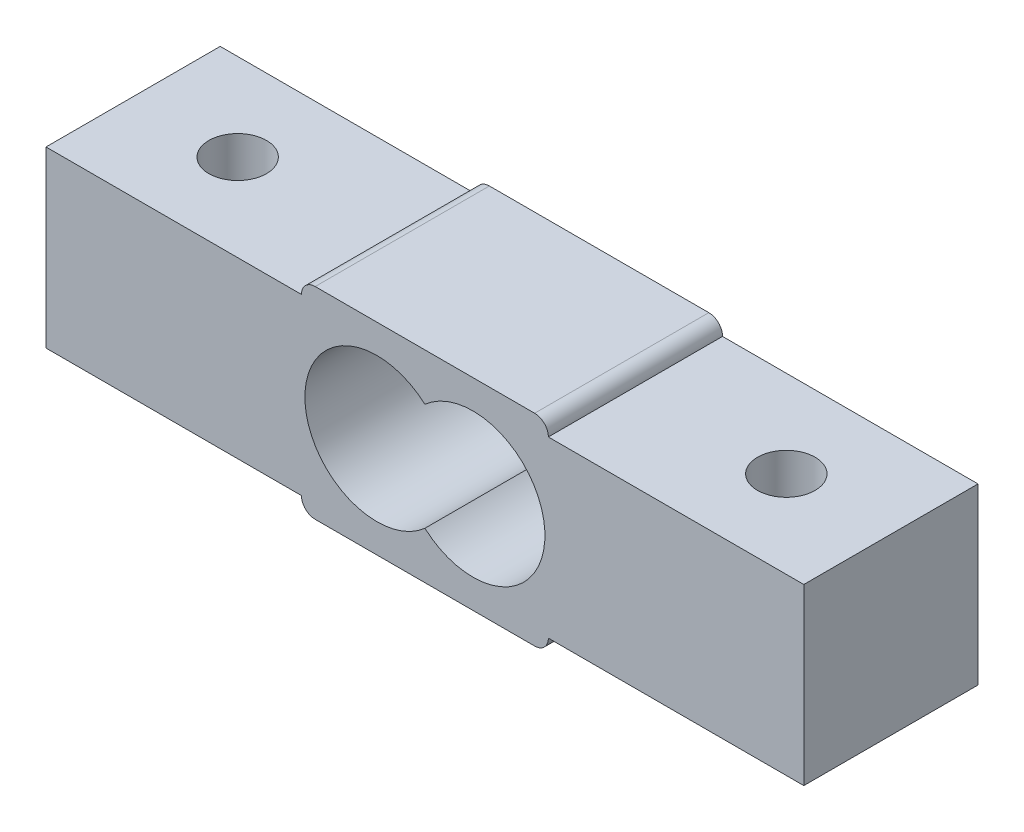
ISO-10303-21;
HEADER;
FILE_DESCRIPTION(('STEP AP214'),'2;1');
FILE_NAME('part.step','',(''),(''),'','','');
FILE_SCHEMA(('AUTOMOTIVE_DESIGN { 1 0 10303 214 1 1 1 1 }'));
ENDSEC;
DATA;
#1=APPLICATION_CONTEXT('core data for automotive mechanical design processes');
#2=APPLICATION_PROTOCOL_DEFINITION('international standard','automotive_design',2000,#1);
#3=PRODUCT_CONTEXT('',#1,'mechanical');
#4=PRODUCT('Part','Part','',(#3));
#5=PRODUCT_RELATED_PRODUCT_CATEGORY('part','',(#4));
#6=PRODUCT_DEFINITION_FORMATION('','',#4);
#7=PRODUCT_DEFINITION_CONTEXT('part definition',#1,'design');
#8=PRODUCT_DEFINITION('design','',#6,#7);
#9=PRODUCT_DEFINITION_SHAPE('','',#8);
#10=(LENGTH_UNIT() NAMED_UNIT(*) SI_UNIT(.MILLI.,.METRE.));
#11=(NAMED_UNIT(*) PLANE_ANGLE_UNIT() SI_UNIT($,.RADIAN.));
#12=(NAMED_UNIT(*) SI_UNIT($,.STERADIAN.) SOLID_ANGLE_UNIT());
#13=UNCERTAINTY_MEASURE_WITH_UNIT(LENGTH_MEASURE(1.E-05),#10,'distance_accuracy_value','');
#14=(GEOMETRIC_REPRESENTATION_CONTEXT(3) GLOBAL_UNCERTAINTY_ASSIGNED_CONTEXT((#13)) GLOBAL_UNIT_ASSIGNED_CONTEXT((#10,
#11,#12)) REPRESENTATION_CONTEXT('',''));
#15=CARTESIAN_POINT('',(0.,0.,0.));
#16=DIRECTION('',(0.,0.,1.));
#17=DIRECTION('',(1.,0.,0.));
#18=AXIS2_PLACEMENT_3D('',#15,#16,#17);
#19=CARTESIAN_POINT('',(-27.625,-6.35,12.7));
#20=DIRECTION('',(0.,1.,0.));
#21=DIRECTION('',(0.,0.,1.));
#22=AXIS2_PLACEMENT_3D('',#19,#20,#21);
#23=PLANE('',#22);
#24=CARTESIAN_POINT('',(20.,-6.35,6.35000000000001));
#25=DIRECTION('',(0.,1.,0.));
#26=DIRECTION('',(0.,0.,1.));
#27=AXIS2_PLACEMENT_3D('',#24,#25,#26);
#28=CIRCLE('',#27,2.1);
#29=CARTESIAN_POINT('',(20.,-6.35,8.45));
#30=VERTEX_POINT('',#29);
#31=EDGE_CURVE('E229',#30,#30,#28,.T.);
#32=ORIENTED_EDGE('',*,*,#31,.T.);
#33=EDGE_LOOP('',(#32));
#34=FACE_BOUND('',#33,.T.);
#35=DIRECTION('',(1.,0.,0.));
#36=VECTOR('',#35,1.);
#37=CARTESIAN_POINT('',(-27.625,-6.35,12.7));
#38=LINE('',#37,#36);
#39=CARTESIAN_POINT('',(9.,-6.35,12.7));
#40=VERTEX_POINT('',#39);
#41=CARTESIAN_POINT('',(27.625,-6.35,12.7));
#42=VERTEX_POINT('',#41);
#43=EDGE_CURVE('E142',#40,#42,#38,.T.);
#44=ORIENTED_EDGE('',*,*,#43,.F.);
#45=DIRECTION('',(0.,0.,-1.));
#46=VECTOR('',#45,1.);
#47=CARTESIAN_POINT('',(9.,-6.35,12.7));
#48=LINE('',#47,#46);
#49=CARTESIAN_POINT('',(9.,-6.35,0.));
#50=VERTEX_POINT('',#49);
#51=EDGE_CURVE('E153',#40,#50,#48,.T.);
#52=ORIENTED_EDGE('',*,*,#51,.T.);
#53=DIRECTION('',(1.,0.,0.));
#54=VECTOR('',#53,1.);
#55=CARTESIAN_POINT('',(-27.625,-6.35,0.));
#56=LINE('',#55,#54);
#57=CARTESIAN_POINT('',(27.625,-6.35,0.));
#58=VERTEX_POINT('',#57);
#59=EDGE_CURVE('E200',#50,#58,#56,.T.);
#60=ORIENTED_EDGE('',*,*,#59,.T.);
#61=DIRECTION('',(0.,0.,-1.));
#62=VECTOR('',#61,1.);
#63=CARTESIAN_POINT('',(27.625,-6.35,12.7));
#64=LINE('',#63,#62);
#65=EDGE_CURVE('E156',#42,#58,#64,.T.);
#66=ORIENTED_EDGE('',*,*,#65,.F.);
#67=EDGE_LOOP('',(#44,#52,#60,#66));
#68=FACE_BOUND('',#67,.T.);
#69=ADVANCED_FACE('F36',(#34,#68),#23,.F.);
#70=CARTESIAN_POINT('',(-27.625,6.35,12.7));
#71=DIRECTION('',(0.,-1.,0.));
#72=DIRECTION('',(0.,0.,-1.));
#73=AXIS2_PLACEMENT_3D('',#70,#71,#72);
#74=PLANE('',#73);
#75=CARTESIAN_POINT('',(20.,6.35,6.35000000000001));
#76=DIRECTION('',(0.,1.,0.));
#77=DIRECTION('',(0.,0.,1.));
#78=AXIS2_PLACEMENT_3D('',#75,#76,#77);
#79=CIRCLE('',#78,2.1);
#80=CARTESIAN_POINT('',(20.,6.35,8.45));
#81=VERTEX_POINT('',#80);
#82=EDGE_CURVE('E328',#81,#81,#79,.T.);
#83=ORIENTED_EDGE('',*,*,#82,.F.);
#84=EDGE_LOOP('',(#83));
#85=FACE_BOUND('',#84,.T.);
#86=DIRECTION('',(0.,0.,-1.));
#87=VECTOR('',#86,1.);
#88=CARTESIAN_POINT('',(9.,6.35,12.7));
#89=LINE('',#88,#87);
#90=CARTESIAN_POINT('',(8.99999999999999,6.35,12.7));
#91=VERTEX_POINT('',#90);
#92=CARTESIAN_POINT('',(8.99999999999999,6.35,0.));
#93=VERTEX_POINT('',#92);
#94=EDGE_CURVE('E190',#91,#93,#89,.T.);
#95=ORIENTED_EDGE('',*,*,#94,.F.);
#96=DIRECTION('',(-1.,0.,0.));
#97=VECTOR('',#96,1.);
#98=CARTESIAN_POINT('',(-27.625,6.35,12.7));
#99=LINE('',#98,#97);
#100=CARTESIAN_POINT('',(27.625,6.35,12.7));
#101=VERTEX_POINT('',#100);
#102=EDGE_CURVE('E341',#101,#91,#99,.T.);
#103=ORIENTED_EDGE('',*,*,#102,.F.);
#104=DIRECTION('',(0.,0.,-1.));
#105=VECTOR('',#104,1.);
#106=CARTESIAN_POINT('',(27.625,6.35,12.7));
#107=LINE('',#106,#105);
#108=CARTESIAN_POINT('',(27.625,6.35,0.));
#109=VERTEX_POINT('',#108);
#110=EDGE_CURVE('E215',#101,#109,#107,.T.);
#111=ORIENTED_EDGE('',*,*,#110,.T.);
#112=DIRECTION('',(-1.,0.,0.));
#113=VECTOR('',#112,1.);
#114=CARTESIAN_POINT('',(-27.625,6.35,0.));
#115=LINE('',#114,#113);
#116=EDGE_CURVE('E218',#109,#93,#115,.T.);
#117=ORIENTED_EDGE('',*,*,#116,.T.);
#118=EDGE_LOOP('',(#95,#103,#111,#117));
#119=FACE_BOUND('',#118,.T.);
#120=ADVANCED_FACE('F304',(#85,#119),#74,.F.);
#121=CARTESIAN_POINT('',(-20.,6.35,6.35000000000001));
#122=DIRECTION('',(0.,1.,0.));
#123=DIRECTION('',(0.,0.,1.));
#124=AXIS2_PLACEMENT_3D('',#121,#122,#123);
#125=CIRCLE('',#124,2.1);
#126=CARTESIAN_POINT('',(-20.,6.35,8.45));
#127=VERTEX_POINT('',#126);
#128=EDGE_CURVE('E329',#127,#127,#125,.T.);
#129=ORIENTED_EDGE('',*,*,#128,.F.);
#130=EDGE_LOOP('',(#129));
#131=FACE_BOUND('',#130,.T.);
#132=DIRECTION('',(0.,0.,1.));
#133=VECTOR('',#132,1.);
#134=CARTESIAN_POINT('',(-9.,6.35,12.7));
#135=LINE('',#134,#133);
#136=CARTESIAN_POINT('',(-9.,6.35,0.));
#137=VERTEX_POINT('',#136);
#138=CARTESIAN_POINT('',(-9.,6.35,12.7));
#139=VERTEX_POINT('',#138);
#140=EDGE_CURVE('E182',#137,#139,#135,.T.);
#141=ORIENTED_EDGE('',*,*,#140,.F.);
#142=CARTESIAN_POINT('',(-27.625,6.35,0.));
#143=VERTEX_POINT('',#142);
#144=EDGE_CURVE('E221',#137,#143,#115,.T.);
#145=ORIENTED_EDGE('',*,*,#144,.T.);
#146=DIRECTION('',(0.,0.,-1.));
#147=VECTOR('',#146,1.);
#148=CARTESIAN_POINT('',(-27.625,6.35,12.7));
#149=LINE('',#148,#147);
#150=CARTESIAN_POINT('',(-27.625,6.35,12.7));
#151=VERTEX_POINT('',#150);
#152=EDGE_CURVE('E212',#151,#143,#149,.T.);
#153=ORIENTED_EDGE('',*,*,#152,.F.);
#154=EDGE_CURVE('E295',#139,#151,#99,.T.);
#155=ORIENTED_EDGE('',*,*,#154,.F.);
#156=EDGE_LOOP('',(#141,#145,#153,#155));
#157=FACE_BOUND('',#156,.T.);
#158=ADVANCED_FACE('F294',(#131,#157),#74,.F.);
#159=CARTESIAN_POINT('',(27.625,-6.35,12.7));
#160=DIRECTION('',(-1.,0.,0.));
#161=DIRECTION('',(0.,0.,1.));
#162=AXIS2_PLACEMENT_3D('',#159,#160,#161);
#163=PLANE('',#162);
#164=DIRECTION('',(0.,1.,0.));
#165=VECTOR('',#164,1.);
#166=CARTESIAN_POINT('',(27.625,-6.35,0.));
#167=LINE('',#166,#165);
#168=EDGE_CURVE('E225',#58,#109,#167,.T.);
#169=ORIENTED_EDGE('',*,*,#168,.T.);
#170=ORIENTED_EDGE('',*,*,#110,.F.);
#171=DIRECTION('',(0.,1.,0.));
#172=VECTOR('',#171,1.);
#173=CARTESIAN_POINT('',(27.625,-6.35,12.7));
#174=LINE('',#173,#172);
#175=EDGE_CURVE('E199',#42,#101,#174,.T.);
#176=ORIENTED_EDGE('',*,*,#175,.F.);
#177=ORIENTED_EDGE('',*,*,#65,.T.);
#178=EDGE_LOOP('',(#169,#170,#176,#177));
#179=FACE_BOUND('',#178,.T.);
#180=ADVANCED_FACE('F323',(#179),#163,.F.);
#181=CARTESIAN_POINT('',(-27.625,-6.35,12.7));
#182=DIRECTION('',(1.,0.,0.));
#183=DIRECTION('',(0.,0.,-1.));
#184=AXIS2_PLACEMENT_3D('',#181,#182,#183);
#185=PLANE('',#184);
#186=DIRECTION('',(0.,-1.,0.));
#187=VECTOR('',#186,1.);
#188=CARTESIAN_POINT('',(-27.625,-6.35,0.));
#189=LINE('',#188,#187);
#190=CARTESIAN_POINT('',(-27.625,-6.35,0.));
#191=VERTEX_POINT('',#190);
#192=EDGE_CURVE('E205',#143,#191,#189,.T.);
#193=ORIENTED_EDGE('',*,*,#192,.T.);
#194=DIRECTION('',(0.,0.,-1.));
#195=VECTOR('',#194,1.);
#196=CARTESIAN_POINT('',(-27.625,-6.35,12.7));
#197=LINE('',#196,#195);
#198=CARTESIAN_POINT('',(-27.625,-6.35,12.7));
#199=VERTEX_POINT('',#198);
#200=EDGE_CURVE('E209',#199,#191,#197,.T.);
#201=ORIENTED_EDGE('',*,*,#200,.F.);
#202=DIRECTION('',(0.,-1.,0.));
#203=VECTOR('',#202,1.);
#204=CARTESIAN_POINT('',(-27.625,-6.35,12.7));
#205=LINE('',#204,#203);
#206=EDGE_CURVE('E159',#151,#199,#205,.T.);
#207=ORIENTED_EDGE('',*,*,#206,.F.);
#208=ORIENTED_EDGE('',*,*,#152,.T.);
#209=EDGE_LOOP('',(#193,#201,#207,#208));
#210=FACE_BOUND('',#209,.T.);
#211=ADVANCED_FACE('F290',(#210),#185,.F.);
#212=CARTESIAN_POINT('',(-20.,-6.35,6.35000000000001));
#213=DIRECTION('',(0.,1.,0.));
#214=DIRECTION('',(0.,0.,1.));
#215=AXIS2_PLACEMENT_3D('',#212,#213,#214);
#216=CIRCLE('',#215,2.1);
#217=CARTESIAN_POINT('',(-20.,-6.35,8.45));
#218=VERTEX_POINT('',#217);
#219=EDGE_CURVE('E326',#218,#218,#216,.T.);
#220=ORIENTED_EDGE('',*,*,#219,.T.);
#221=EDGE_LOOP('',(#220));
#222=FACE_BOUND('',#221,.T.);
#223=CARTESIAN_POINT('',(-9.,-6.35,0.));
#224=VERTEX_POINT('',#223);
#225=EDGE_CURVE('E195',#191,#224,#56,.T.);
#226=ORIENTED_EDGE('',*,*,#225,.T.);
#227=DIRECTION('',(0.,0.,1.));
#228=VECTOR('',#227,1.);
#229=CARTESIAN_POINT('',(-9.,-6.35,12.7));
#230=LINE('',#229,#228);
#231=CARTESIAN_POINT('',(-9.,-6.35,12.7));
#232=VERTEX_POINT('',#231);
#233=EDGE_CURVE('E163',#224,#232,#230,.T.);
#234=ORIENTED_EDGE('',*,*,#233,.T.);
#235=EDGE_CURVE('E158',#199,#232,#38,.T.);
#236=ORIENTED_EDGE('',*,*,#235,.F.);
#237=ORIENTED_EDGE('',*,*,#200,.T.);
#238=EDGE_LOOP('',(#226,#234,#236,#237));
#239=FACE_BOUND('',#238,.T.);
#240=ADVANCED_FACE('F239',(#222,#239),#23,.F.);
#241=CARTESIAN_POINT('',(0.,0.,12.7));
#242=DIRECTION('',(0.,0.,-1.));
#243=DIRECTION('',(-1.,0.,0.));
#244=AXIS2_PLACEMENT_3D('',#241,#242,#243);
#245=PLANE('',#244);
#246=CARTESIAN_POINT('',(-3.5,0.,12.7));
#247=DIRECTION('',(0.,0.,1.));
#248=DIRECTION('',(1.,0.,0.));
#249=AXIS2_PLACEMENT_3D('',#246,#247,#248);
#250=CIRCLE('',#249,5.25);
#251=CARTESIAN_POINT('',(0.,3.91311896062463,12.7));
#252=VERTEX_POINT('',#251);
#253=CARTESIAN_POINT('',(0.,-3.91311896062463,12.7));
#254=VERTEX_POINT('',#253);
#255=EDGE_CURVE('E386',#252,#254,#250,.T.);
#256=ORIENTED_EDGE('',*,*,#255,.F.);
#257=CARTESIAN_POINT('',(3.5,0.,12.7));
#258=DIRECTION('',(0.,0.,1.));
#259=DIRECTION('',(1.,0.,0.));
#260=AXIS2_PLACEMENT_3D('',#257,#258,#259);
#261=CIRCLE('',#260,5.25);
#262=EDGE_CURVE('E184',#254,#252,#261,.T.);
#263=ORIENTED_EDGE('',*,*,#262,.F.);
#264=EDGE_LOOP('',(#256,#263));
#265=FACE_BOUND('',#264,.T.);
#266=DIRECTION('',(1.,0.,0.));
#267=VECTOR('',#266,1.);
#268=CARTESIAN_POINT('',(-9.,-7.35,12.7));
#269=LINE('',#268,#267);
#270=CARTESIAN_POINT('',(-8.,-7.35,12.7));
#271=VERTEX_POINT('',#270);
#272=CARTESIAN_POINT('',(8.,-7.35,12.7));
#273=VERTEX_POINT('',#272);
#274=EDGE_CURVE('E145',#271,#273,#269,.T.);
#275=ORIENTED_EDGE('',*,*,#274,.T.);
#276=CARTESIAN_POINT('',(8.,-6.35,12.7));
#277=DIRECTION('',(0.,0.,-1.));
#278=DIRECTION('',(-1.,0.,0.));
#279=AXIS2_PLACEMENT_3D('',#276,#277,#278);
#280=CIRCLE('',#279,1.);
#281=EDGE_CURVE('E138',#273,#40,#280,.F.);
#282=ORIENTED_EDGE('',*,*,#281,.T.);
#283=ORIENTED_EDGE('',*,*,#43,.T.);
#284=ORIENTED_EDGE('',*,*,#175,.T.);
#285=ORIENTED_EDGE('',*,*,#102,.T.);
#286=CARTESIAN_POINT('',(8.,6.35,12.7));
#287=DIRECTION('',(0.,0.,-1.));
#288=DIRECTION('',(-1.,0.,0.));
#289=AXIS2_PLACEMENT_3D('',#286,#287,#288);
#290=CIRCLE('',#289,1.);
#291=CARTESIAN_POINT('',(8.,7.35,12.7));
#292=VERTEX_POINT('',#291);
#293=EDGE_CURVE('E51',#91,#292,#290,.F.);
#294=ORIENTED_EDGE('',*,*,#293,.T.);
#295=DIRECTION('',(1.,0.,0.));
#296=VECTOR('',#295,1.);
#297=CARTESIAN_POINT('',(-9.,7.35,12.7));
#298=LINE('',#297,#296);
#299=CARTESIAN_POINT('',(-8.,7.35,12.7));
#300=VERTEX_POINT('',#299);
#301=EDGE_CURVE('E181',#300,#292,#298,.T.);
#302=ORIENTED_EDGE('',*,*,#301,.F.);
#303=CARTESIAN_POINT('',(-8.,6.35,12.7));
#304=DIRECTION('',(0.,0.,-1.));
#305=DIRECTION('',(-1.,0.,0.));
#306=AXIS2_PLACEMENT_3D('',#303,#304,#305);
#307=CIRCLE('',#306,1.);
#308=EDGE_CURVE('E59',#300,#139,#307,.F.);
#309=ORIENTED_EDGE('',*,*,#308,.T.);
#310=ORIENTED_EDGE('',*,*,#154,.T.);
#311=ORIENTED_EDGE('',*,*,#206,.T.);
#312=ORIENTED_EDGE('',*,*,#235,.T.);
#313=CARTESIAN_POINT('',(-8.,-6.35,12.7));
#314=DIRECTION('',(0.,0.,-1.));
#315=DIRECTION('',(-1.,0.,0.));
#316=AXIS2_PLACEMENT_3D('',#313,#314,#315);
#317=CIRCLE('',#316,1.);
#318=EDGE_CURVE('E149',#232,#271,#317,.F.);
#319=ORIENTED_EDGE('',*,*,#318,.T.);
#320=EDGE_LOOP('',(#275,#282,#283,#284,#285,#294,#302,#309,#310,#311,#312,#319));
#321=FACE_BOUND('',#320,.T.);
#322=ADVANCED_FACE('F140',(#265,#321),#245,.F.);
#323=CARTESIAN_POINT('',(0.,0.,0.));
#324=DIRECTION('',(0.,0.,-1.));
#325=DIRECTION('',(-1.,0.,0.));
#326=AXIS2_PLACEMENT_3D('',#323,#324,#325);
#327=PLANE('',#326);
#328=CARTESIAN_POINT('',(3.5,0.,0.));
#329=DIRECTION('',(0.,0.,1.));
#330=DIRECTION('',(1.,0.,0.));
#331=AXIS2_PLACEMENT_3D('',#328,#329,#330);
#332=CIRCLE('',#331,5.25);
#333=CARTESIAN_POINT('',(0.,-3.91311896062463,0.));
#334=VERTEX_POINT('',#333);
#335=CARTESIAN_POINT('',(0.,3.91311896062463,0.));
#336=VERTEX_POINT('',#335);
#337=EDGE_CURVE('E382',#334,#336,#332,.T.);
#338=ORIENTED_EDGE('',*,*,#337,.T.);
#339=CARTESIAN_POINT('',(-3.5,0.,0.));
#340=DIRECTION('',(0.,0.,1.));
#341=DIRECTION('',(1.,0.,0.));
#342=AXIS2_PLACEMENT_3D('',#339,#340,#341);
#343=CIRCLE('',#342,5.25);
#344=EDGE_CURVE('E384',#336,#334,#343,.T.);
#345=ORIENTED_EDGE('',*,*,#344,.T.);
#346=EDGE_LOOP('',(#338,#345));
#347=FACE_BOUND('',#346,.T.);
#348=ORIENTED_EDGE('',*,*,#59,.F.);
#349=CARTESIAN_POINT('',(8.,-6.35,0.));
#350=DIRECTION('',(0.,0.,-1.));
#351=DIRECTION('',(-1.,0.,0.));
#352=AXIS2_PLACEMENT_3D('',#349,#350,#351);
#353=CIRCLE('',#352,1.);
#354=CARTESIAN_POINT('',(8.,-7.35,0.));
#355=VERTEX_POINT('',#354);
#356=EDGE_CURVE('E162',#50,#355,#353,.T.);
#357=ORIENTED_EDGE('',*,*,#356,.T.);
#358=DIRECTION('',(-1.,0.,0.));
#359=VECTOR('',#358,1.);
#360=CARTESIAN_POINT('',(-9.,-7.35,0.));
#361=LINE('',#360,#359);
#362=CARTESIAN_POINT('',(-8.,-7.35,0.));
#363=VERTEX_POINT('',#362);
#364=EDGE_CURVE('E174',#355,#363,#361,.T.);
#365=ORIENTED_EDGE('',*,*,#364,.T.);
#366=CARTESIAN_POINT('',(-8.,-6.35,0.));
#367=DIRECTION('',(0.,0.,-1.));
#368=DIRECTION('',(-1.,0.,0.));
#369=AXIS2_PLACEMENT_3D('',#366,#367,#368);
#370=CIRCLE('',#369,1.);
#371=EDGE_CURVE('E246',#363,#224,#370,.T.);
#372=ORIENTED_EDGE('',*,*,#371,.T.);
#373=ORIENTED_EDGE('',*,*,#225,.F.);
#374=ORIENTED_EDGE('',*,*,#192,.F.);
#375=ORIENTED_EDGE('',*,*,#144,.F.);
#376=CARTESIAN_POINT('',(-8.,6.35,0.));
#377=DIRECTION('',(0.,0.,-1.));
#378=DIRECTION('',(-1.,0.,0.));
#379=AXIS2_PLACEMENT_3D('',#376,#377,#378);
#380=CIRCLE('',#379,1.);
#381=CARTESIAN_POINT('',(-8.,7.35,0.));
#382=VERTEX_POINT('',#381);
#383=EDGE_CURVE('E266',#137,#382,#380,.T.);
#384=ORIENTED_EDGE('',*,*,#383,.T.);
#385=DIRECTION('',(-1.,0.,0.));
#386=VECTOR('',#385,1.);
#387=CARTESIAN_POINT('',(-9.,7.35,0.));
#388=LINE('',#387,#386);
#389=CARTESIAN_POINT('',(8.,7.35,0.));
#390=VERTEX_POINT('',#389);
#391=EDGE_CURVE('E178',#390,#382,#388,.T.);
#392=ORIENTED_EDGE('',*,*,#391,.F.);
#393=CARTESIAN_POINT('',(8.,6.35,0.));
#394=DIRECTION('',(0.,0.,-1.));
#395=DIRECTION('',(-1.,0.,0.));
#396=AXIS2_PLACEMENT_3D('',#393,#394,#395);
#397=CIRCLE('',#396,1.);
#398=EDGE_CURVE('E170',#390,#93,#397,.T.);
#399=ORIENTED_EDGE('',*,*,#398,.T.);
#400=ORIENTED_EDGE('',*,*,#116,.F.);
#401=ORIENTED_EDGE('',*,*,#168,.F.);
#402=EDGE_LOOP('',(#348,#357,#365,#372,#373,#374,#375,#384,#392,#399,#400,#401));
#403=FACE_BOUND('',#402,.T.);
#404=ADVANCED_FACE('F263',(#347,#403),#327,.T.);
#405=CARTESIAN_POINT('',(20.,6.35,6.35000000000001));
#406=DIRECTION('',(0.,1.,0.));
#407=DIRECTION('',(0.,0.,1.));
#408=AXIS2_PLACEMENT_3D('',#405,#406,#407);
#409=CYLINDRICAL_SURFACE('',#408,2.1);
#410=ORIENTED_EDGE('',*,*,#31,.F.);
#411=EDGE_LOOP('',(#410));
#412=FACE_BOUND('',#411,.T.);
#413=ORIENTED_EDGE('',*,*,#82,.T.);
#414=EDGE_LOOP('',(#413));
#415=FACE_BOUND('',#414,.T.);
#416=ADVANCED_FACE('F373',(#412,#415),#409,.F.);
#417=CARTESIAN_POINT('',(-20.,6.35,6.35000000000001));
#418=DIRECTION('',(0.,1.,0.));
#419=DIRECTION('',(0.,0.,1.));
#420=AXIS2_PLACEMENT_3D('',#417,#418,#419);
#421=CYLINDRICAL_SURFACE('',#420,2.1);
#422=ORIENTED_EDGE('',*,*,#219,.F.);
#423=EDGE_LOOP('',(#422));
#424=FACE_BOUND('',#423,.T.);
#425=ORIENTED_EDGE('',*,*,#128,.T.);
#426=EDGE_LOOP('',(#425));
#427=FACE_BOUND('',#426,.T.);
#428=ADVANCED_FACE('F369',(#424,#427),#421,.F.);
#429=CARTESIAN_POINT('',(3.5,0.,0.));
#430=DIRECTION('',(0.,0.,1.));
#431=DIRECTION('',(1.,0.,0.));
#432=AXIS2_PLACEMENT_3D('',#429,#430,#431);
#433=CYLINDRICAL_SURFACE('',#432,5.25);
#434=ORIENTED_EDGE('',*,*,#262,.T.);
#435=DIRECTION('',(0.,0.,1.));
#436=VECTOR('',#435,1.);
#437=CARTESIAN_POINT('',(0.,3.91311896062463,0.));
#438=LINE('',#437,#436);
#439=EDGE_CURVE('E387',#336,#252,#438,.T.);
#440=ORIENTED_EDGE('',*,*,#439,.F.);
#441=ORIENTED_EDGE('',*,*,#337,.F.);
#442=DIRECTION('',(0.,0.,1.));
#443=VECTOR('',#442,1.);
#444=CARTESIAN_POINT('',(0.,-3.91311896062463,0.));
#445=LINE('',#444,#443);
#446=EDGE_CURVE('E334',#334,#254,#445,.T.);
#447=ORIENTED_EDGE('',*,*,#446,.T.);
#448=EDGE_LOOP('',(#434,#440,#441,#447));
#449=FACE_BOUND('',#448,.T.);
#450=ADVANCED_FACE('F365',(#449),#433,.F.);
#451=CARTESIAN_POINT('',(-3.5,0.,0.));
#452=DIRECTION('',(0.,0.,1.));
#453=DIRECTION('',(1.,0.,0.));
#454=AXIS2_PLACEMENT_3D('',#451,#452,#453);
#455=CYLINDRICAL_SURFACE('',#454,5.25);
#456=ORIENTED_EDGE('',*,*,#255,.T.);
#457=ORIENTED_EDGE('',*,*,#446,.F.);
#458=ORIENTED_EDGE('',*,*,#344,.F.);
#459=ORIENTED_EDGE('',*,*,#439,.T.);
#460=EDGE_LOOP('',(#456,#457,#458,#459));
#461=FACE_BOUND('',#460,.T.);
#462=ADVANCED_FACE('F360',(#461),#455,.F.);
#463=CARTESIAN_POINT('',(0.,7.35,0.));
#464=DIRECTION('',(0.,-1.,0.));
#465=DIRECTION('',(0.,0.,-1.));
#466=AXIS2_PLACEMENT_3D('',#463,#464,#465);
#467=PLANE('',#466);
#468=ORIENTED_EDGE('',*,*,#391,.T.);
#469=DIRECTION('',(0.,0.,1.));
#470=VECTOR('',#469,1.);
#471=CARTESIAN_POINT('',(-8.,7.35,0.));
#472=LINE('',#471,#470);
#473=EDGE_CURVE('E11',#382,#300,#472,.T.);
#474=ORIENTED_EDGE('',*,*,#473,.T.);
#475=ORIENTED_EDGE('',*,*,#301,.T.);
#476=DIRECTION('',(0.,0.,-1.));
#477=VECTOR('',#476,1.);
#478=CARTESIAN_POINT('',(8.,7.35,0.));
#479=LINE('',#478,#477);
#480=EDGE_CURVE('E44',#292,#390,#479,.T.);
#481=ORIENTED_EDGE('',*,*,#480,.T.);
#482=EDGE_LOOP('',(#468,#474,#475,#481));
#483=FACE_BOUND('',#482,.T.);
#484=ADVANCED_FACE('F260',(#483),#467,.F.);
#485=CARTESIAN_POINT('',(0.,-7.35,0.));
#486=DIRECTION('',(0.,1.,0.));
#487=DIRECTION('',(0.,0.,-1.));
#488=AXIS2_PLACEMENT_3D('',#485,#486,#487);
#489=PLANE('',#488);
#490=ORIENTED_EDGE('',*,*,#364,.F.);
#491=DIRECTION('',(0.,0.,-1.));
#492=VECTOR('',#491,1.);
#493=CARTESIAN_POINT('',(8.,-7.35,12.7));
#494=LINE('',#493,#492);
#495=EDGE_CURVE('E280',#355,#273,#494,.F.);
#496=ORIENTED_EDGE('',*,*,#495,.T.);
#497=ORIENTED_EDGE('',*,*,#274,.F.);
#498=DIRECTION('',(0.,0.,1.));
#499=VECTOR('',#498,1.);
#500=CARTESIAN_POINT('',(-8.,-7.35,0.));
#501=LINE('',#500,#499);
#502=EDGE_CURVE('E247',#271,#363,#501,.F.);
#503=ORIENTED_EDGE('',*,*,#502,.T.);
#504=EDGE_LOOP('',(#490,#496,#497,#503));
#505=FACE_BOUND('',#504,.T.);
#506=ADVANCED_FACE('F286',(#505),#489,.F.);
#507=CARTESIAN_POINT('',(8.,-6.35,12.7));
#508=DIRECTION('',(0.,0.,1.));
#509=DIRECTION('',(1.,0.,0.));
#510=AXIS2_PLACEMENT_3D('',#507,#508,#509);
#511=CYLINDRICAL_SURFACE('',#510,1.);
#512=ORIENTED_EDGE('',*,*,#281,.F.);
#513=ORIENTED_EDGE('',*,*,#495,.F.);
#514=ORIENTED_EDGE('',*,*,#356,.F.);
#515=ORIENTED_EDGE('',*,*,#51,.F.);
#516=EDGE_LOOP('',(#512,#513,#514,#515));
#517=FACE_BOUND('',#516,.T.);
#518=ADVANCED_FACE('F161',(#517),#511,.T.);
#519=CARTESIAN_POINT('',(-8.,-6.35,12.7));
#520=DIRECTION('',(0.,0.,-1.));
#521=DIRECTION('',(-1.,0.,0.));
#522=AXIS2_PLACEMENT_3D('',#519,#520,#521);
#523=CYLINDRICAL_SURFACE('',#522,1.);
#524=ORIENTED_EDGE('',*,*,#371,.F.);
#525=ORIENTED_EDGE('',*,*,#502,.F.);
#526=ORIENTED_EDGE('',*,*,#318,.F.);
#527=ORIENTED_EDGE('',*,*,#233,.F.);
#528=EDGE_LOOP('',(#524,#525,#526,#527));
#529=FACE_BOUND('',#528,.T.);
#530=ADVANCED_FACE('F244',(#529),#523,.T.);
#531=CARTESIAN_POINT('',(-8.,6.35,0.));
#532=DIRECTION('',(0.,0.,1.));
#533=DIRECTION('',(1.,0.,0.));
#534=AXIS2_PLACEMENT_3D('',#531,#532,#533);
#535=CYLINDRICAL_SURFACE('',#534,1.);
#536=ORIENTED_EDGE('',*,*,#383,.F.);
#537=ORIENTED_EDGE('',*,*,#140,.T.);
#538=ORIENTED_EDGE('',*,*,#308,.F.);
#539=ORIENTED_EDGE('',*,*,#473,.F.);
#540=EDGE_LOOP('',(#536,#537,#538,#539));
#541=FACE_BOUND('',#540,.T.);
#542=ADVANCED_FACE('F296',(#541),#535,.T.);
#543=CARTESIAN_POINT('',(8.,6.35,0.));
#544=DIRECTION('',(0.,0.,-1.));
#545=DIRECTION('',(-1.,0.,0.));
#546=AXIS2_PLACEMENT_3D('',#543,#544,#545);
#547=CYLINDRICAL_SURFACE('',#546,1.);
#548=ORIENTED_EDGE('',*,*,#293,.F.);
#549=ORIENTED_EDGE('',*,*,#94,.T.);
#550=ORIENTED_EDGE('',*,*,#398,.F.);
#551=ORIENTED_EDGE('',*,*,#480,.F.);
#552=EDGE_LOOP('',(#548,#549,#550,#551));
#553=FACE_BOUND('',#552,.T.);
#554=ADVANCED_FACE('F38',(#553),#547,.T.);
#555=CLOSED_SHELL('',(#69,#120,#158,#180,#211,#240,#322,#404,#416,#428,#450,#462,#484,#506,#518,
#530,#542,#554));
#556=MANIFOLD_SOLID_BREP('B2',#555);
#557=ADVANCED_BREP_SHAPE_REPRESENTATION('',(#18,#556),#14);
#558=SHAPE_DEFINITION_REPRESENTATION(#9,#557);
ENDSEC;
END-ISO-10303-21;
